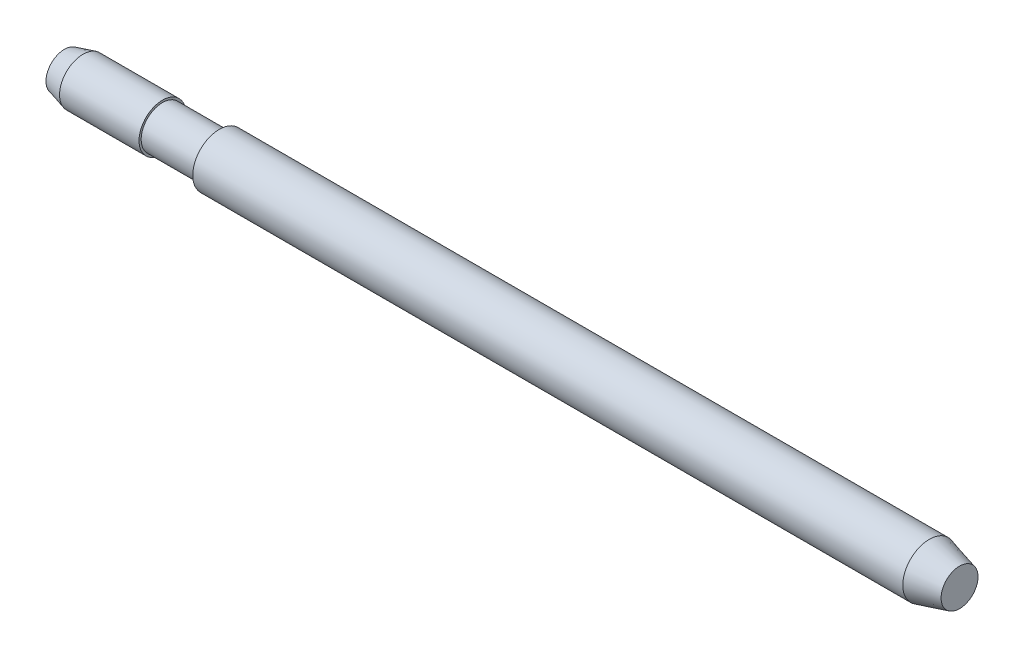
ISO-10303-21;
HEADER;
FILE_DESCRIPTION(('STEP AP214'),'2;1');
FILE_NAME('part.step','',(''),(''),'','','');
FILE_SCHEMA(('AUTOMOTIVE_DESIGN { 1 0 10303 214 1 1 1 1 }'));
ENDSEC;
DATA;
#1=APPLICATION_CONTEXT('core data for automotive mechanical design processes');
#2=APPLICATION_PROTOCOL_DEFINITION('international standard','automotive_design',2000,#1);
#3=PRODUCT_CONTEXT('',#1,'mechanical');
#4=PRODUCT('Part','Part','',(#3));
#5=PRODUCT_RELATED_PRODUCT_CATEGORY('part','',(#4));
#6=PRODUCT_DEFINITION_FORMATION('','',#4);
#7=PRODUCT_DEFINITION_CONTEXT('part definition',#1,'design');
#8=PRODUCT_DEFINITION('design','',#6,#7);
#9=PRODUCT_DEFINITION_SHAPE('','',#8);
#10=(LENGTH_UNIT() NAMED_UNIT(*) SI_UNIT(.MILLI.,.METRE.));
#11=(NAMED_UNIT(*) PLANE_ANGLE_UNIT() SI_UNIT($,.RADIAN.));
#12=(NAMED_UNIT(*) SI_UNIT($,.STERADIAN.) SOLID_ANGLE_UNIT());
#13=UNCERTAINTY_MEASURE_WITH_UNIT(LENGTH_MEASURE(1.E-05),#10,'distance_accuracy_value','');
#14=(GEOMETRIC_REPRESENTATION_CONTEXT(3) GLOBAL_UNCERTAINTY_ASSIGNED_CONTEXT((#13)) GLOBAL_UNIT_ASSIGNED_CONTEXT((#10,
#11,#12)) REPRESENTATION_CONTEXT('',''));
#15=CARTESIAN_POINT('',(0.,0.,0.));
#16=DIRECTION('',(0.,0.,1.));
#17=DIRECTION('',(1.,0.,0.));
#18=AXIS2_PLACEMENT_3D('',#15,#16,#17);
#19=CARTESIAN_POINT('',(0.,0.,0.));
#20=DIRECTION('',(-1.,0.,0.));
#21=DIRECTION('',(0.,-1.,0.));
#22=AXIS2_PLACEMENT_3D('',#19,#20,#21);
#23=PLANE('',#22);
#24=CARTESIAN_POINT('',(5.6843418860808E-11,0.,0.));
#25=DIRECTION('',(1.,0.,0.));
#26=DIRECTION('',(0.,0.,-1.));
#27=AXIS2_PLACEMENT_3D('',#24,#25,#26);
#28=CIRCLE('',#27,1.65100000001166);
#29=CARTESIAN_POINT('',(5.6843418860808E-11,0.,-1.65100000001166));
#30=VERTEX_POINT('',#29);
#31=EDGE_CURVE('E18',#30,#30,#28,.T.);
#32=ORIENTED_EDGE('',*,*,#31,.F.);
#33=EDGE_LOOP('',(#32));
#34=FACE_BOUND('',#33,.T.);
#35=ADVANCED_FACE('F15',(#34),#23,.T.);
#36=CARTESIAN_POINT('',(1.65889658381957,0.,0.));
#37=DIRECTION('',(1.,0.,0.));
#38=DIRECTION('',(0.,0.,-1.));
#39=AXIS2_PLACEMENT_3D('',#36,#37,#38);
#40=CONICAL_SURFACE('',#39,2.09549999993897,0.261799387788653);
#41=ORIENTED_EDGE('',*,*,#31,.T.);
#42=EDGE_LOOP('',(#41));
#43=FACE_BOUND('',#42,.T.);
#44=CARTESIAN_POINT('',(1.65889658396437,0.,0.));
#45=DIRECTION('',(1.,0.,0.));
#46=DIRECTION('',(0.,1.,0.));
#47=AXIS2_PLACEMENT_3D('',#44,#45,#46);
#48=CIRCLE('',#47,2.09549999999999);
#49=CARTESIAN_POINT('',(1.65889658396437,2.09549999999999,0.));
#50=VERTEX_POINT('',#49);
#51=EDGE_CURVE('E30',#50,#50,#48,.T.);
#52=ORIENTED_EDGE('',*,*,#51,.F.);
#53=EDGE_LOOP('',(#52));
#54=FACE_BOUND('',#53,.T.);
#55=ADVANCED_FACE('F48',(#43,#54),#40,.T.);
#56=CARTESIAN_POINT('',(80.01,0.,0.));
#57=DIRECTION('',(1.,0.,0.));
#58=DIRECTION('',(0.,1.,0.));
#59=AXIS2_PLACEMENT_3D('',#56,#57,#58);
#60=CYLINDRICAL_SURFACE('',#59,2.09549999999999);
#61=ORIENTED_EDGE('',*,*,#51,.T.);
#62=EDGE_LOOP('',(#61));
#63=FACE_BOUND('',#62,.T.);
#64=CARTESIAN_POINT('',(8.76299999999999,0.,0.));
#65=DIRECTION('',(1.,0.,0.));
#66=DIRECTION('',(0.,1.,0.));
#67=AXIS2_PLACEMENT_3D('',#64,#65,#66);
#68=CIRCLE('',#67,2.09549999999999);
#69=CARTESIAN_POINT('',(8.76299999999999,2.09549999999999,0.));
#70=VERTEX_POINT('',#69);
#71=EDGE_CURVE('E32',#70,#70,#68,.T.);
#72=ORIENTED_EDGE('',*,*,#71,.F.);
#73=EDGE_LOOP('',(#72));
#74=FACE_BOUND('',#73,.T.);
#75=ADVANCED_FACE('F46',(#63,#74),#60,.T.);
#76=CARTESIAN_POINT('',(8.763,1.90499999999999,0.));
#77=DIRECTION('',(1.,0.,0.));
#78=DIRECTION('',(0.,1.,0.));
#79=AXIS2_PLACEMENT_3D('',#76,#77,#78);
#80=PLANE('',#79);
#81=CARTESIAN_POINT('',(8.76299999999999,0.,0.));
#82=DIRECTION('',(1.,0.,0.));
#83=DIRECTION('',(0.,1.,0.));
#84=AXIS2_PLACEMENT_3D('',#81,#82,#83);
#85=CIRCLE('',#84,1.90499999999999);
#86=CARTESIAN_POINT('',(8.76299999999999,1.90499999999999,0.));
#87=VERTEX_POINT('',#86);
#88=EDGE_CURVE('E39',#87,#87,#85,.T.);
#89=ORIENTED_EDGE('',*,*,#88,.F.);
#90=EDGE_LOOP('',(#89));
#91=FACE_BOUND('',#90,.T.);
#92=ORIENTED_EDGE('',*,*,#71,.T.);
#93=EDGE_LOOP('',(#92));
#94=FACE_BOUND('',#93,.T.);
#95=ADVANCED_FACE('F44',(#91,#94),#80,.T.);
#96=CARTESIAN_POINT('',(80.01,0.,0.));
#97=DIRECTION('',(1.,0.,0.));
#98=DIRECTION('',(0.,1.,0.));
#99=AXIS2_PLACEMENT_3D('',#96,#97,#98);
#100=CYLINDRICAL_SURFACE('',#99,1.90499999999999);
#101=ORIENTED_EDGE('',*,*,#88,.T.);
#102=EDGE_LOOP('',(#101));
#103=FACE_BOUND('',#102,.T.);
#104=CARTESIAN_POINT('',(13.843,0.,0.));
#105=DIRECTION('',(1.,0.,0.));
#106=DIRECTION('',(0.,1.,0.));
#107=AXIS2_PLACEMENT_3D('',#104,#105,#106);
#108=CIRCLE('',#107,1.90499999999999);
#109=CARTESIAN_POINT('',(13.843,1.90499999999999,0.));
#110=VERTEX_POINT('',#109);
#111=EDGE_CURVE('E36',#110,#110,#108,.T.);
#112=ORIENTED_EDGE('',*,*,#111,.F.);
#113=EDGE_LOOP('',(#112));
#114=FACE_BOUND('',#113,.T.);
#115=ADVANCED_FACE('F56',(#103,#114),#100,.T.);
#116=CARTESIAN_POINT('',(80.01,1.651,0.));
#117=DIRECTION('',(1.,0.,0.));
#118=DIRECTION('',(0.,1.,0.));
#119=AXIS2_PLACEMENT_3D('',#116,#117,#118);
#120=PLANE('',#119);
#121=CARTESIAN_POINT('',(80.0100000000157,0.,0.));
#122=DIRECTION('',(-1.,0.,0.));
#123=DIRECTION('',(0.,0.,1.));
#124=AXIS2_PLACEMENT_3D('',#121,#122,#123);
#125=CIRCLE('',#124,1.6509999999812);
#126=CARTESIAN_POINT('',(80.0100000000157,0.,1.6509999999812));
#127=VERTEX_POINT('',#126);
#128=EDGE_CURVE('E27',#127,#127,#125,.T.);
#129=ORIENTED_EDGE('',*,*,#128,.F.);
#130=EDGE_LOOP('',(#129));
#131=FACE_BOUND('',#130,.T.);
#132=ADVANCED_FACE('F74',(#131),#120,.T.);
#133=CARTESIAN_POINT('',(13.843,2.3749,0.));
#134=DIRECTION('',(-1.,0.,0.));
#135=DIRECTION('',(0.,-1.,0.));
#136=AXIS2_PLACEMENT_3D('',#133,#134,#135);
#137=PLANE('',#136);
#138=CARTESIAN_POINT('',(13.843,0.,0.));
#139=DIRECTION('',(1.,0.,0.));
#140=DIRECTION('',(0.,1.,0.));
#141=AXIS2_PLACEMENT_3D('',#138,#139,#140);
#142=CIRCLE('',#141,2.3749);
#143=CARTESIAN_POINT('',(13.843,2.3749,0.));
#144=VERTEX_POINT('',#143);
#145=EDGE_CURVE('E22',#144,#144,#142,.T.);
#146=ORIENTED_EDGE('',*,*,#145,.F.);
#147=EDGE_LOOP('',(#146));
#148=FACE_BOUND('',#147,.T.);
#149=ORIENTED_EDGE('',*,*,#111,.T.);
#150=EDGE_LOOP('',(#149));
#151=FACE_BOUND('',#150,.T.);
#152=ADVANCED_FACE('F67',(#148,#151),#137,.T.);
#153=CARTESIAN_POINT('',(77.3083684204039,0.,0.));
#154=DIRECTION('',(-1.,0.,0.));
#155=DIRECTION('',(0.,0.,1.));
#156=AXIS2_PLACEMENT_3D('',#153,#154,#155);
#157=CONICAL_SURFACE('',#156,2.37490000000662,0.261799387806757);
#158=CARTESIAN_POINT('',(77.3083684204008,0.,0.));
#159=DIRECTION('',(1.,0.,0.));
#160=DIRECTION('',(0.,1.,0.));
#161=AXIS2_PLACEMENT_3D('',#158,#159,#160);
#162=CIRCLE('',#161,2.3749);
#163=CARTESIAN_POINT('',(77.3083684204008,2.3749,0.));
#164=VERTEX_POINT('',#163);
#165=EDGE_CURVE('E10',#164,#164,#162,.F.);
#166=ORIENTED_EDGE('',*,*,#165,.F.);
#167=EDGE_LOOP('',(#166));
#168=FACE_BOUND('',#167,.T.);
#169=ORIENTED_EDGE('',*,*,#128,.T.);
#170=EDGE_LOOP('',(#169));
#171=FACE_BOUND('',#170,.T.);
#172=ADVANCED_FACE('F62',(#168,#171),#157,.T.);
#173=CARTESIAN_POINT('',(80.01,0.,0.));
#174=DIRECTION('',(1.,0.,0.));
#175=DIRECTION('',(0.,1.,0.));
#176=AXIS2_PLACEMENT_3D('',#173,#174,#175);
#177=CYLINDRICAL_SURFACE('',#176,2.3749);
#178=ORIENTED_EDGE('',*,*,#165,.T.);
#179=EDGE_LOOP('',(#178));
#180=FACE_BOUND('',#179,.T.);
#181=ORIENTED_EDGE('',*,*,#145,.T.);
#182=EDGE_LOOP('',(#181));
#183=FACE_BOUND('',#182,.T.);
#184=ADVANCED_FACE('F60',(#180,#183),#177,.T.);
#185=CLOSED_SHELL('',(#35,#55,#75,#95,#115,#132,#152,#172,#184));
#186=MANIFOLD_SOLID_BREP('B1',#185);
#187=ADVANCED_BREP_SHAPE_REPRESENTATION('',(#18,#186),#14);
#188=SHAPE_DEFINITION_REPRESENTATION(#9,#187);
ENDSEC;
END-ISO-10303-21;
